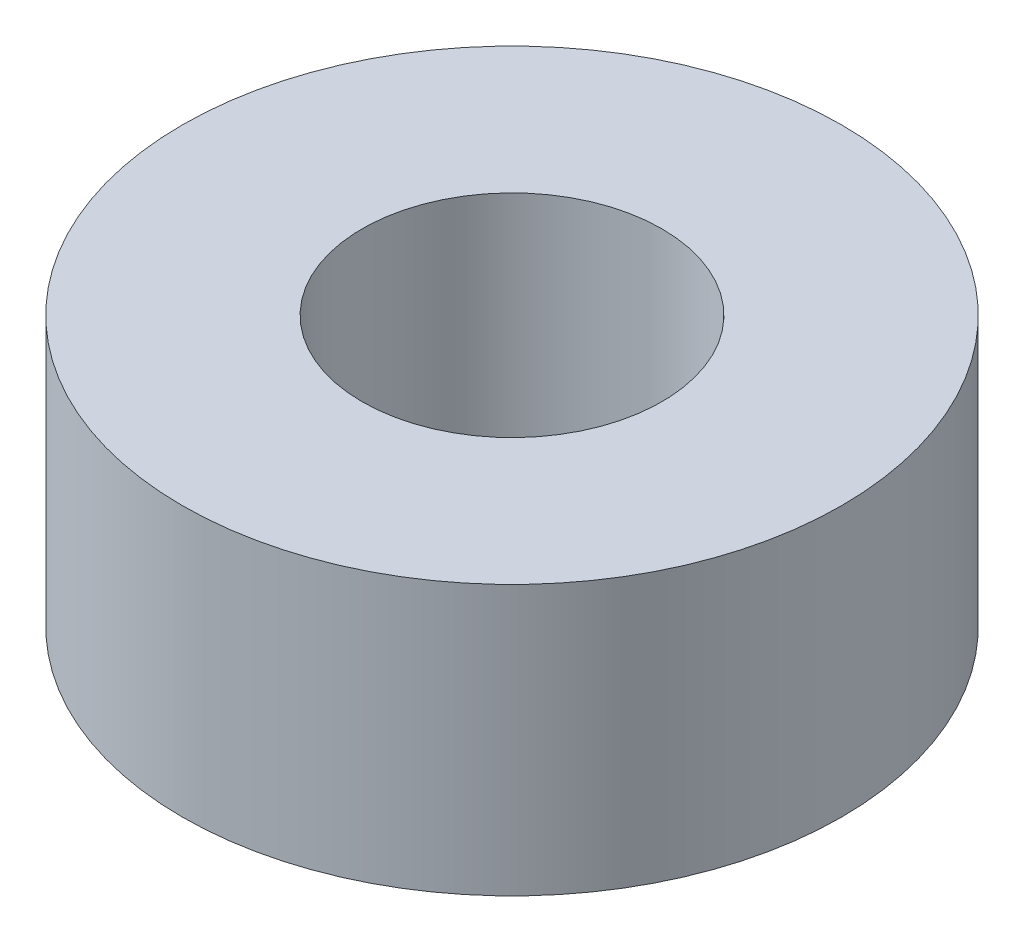
ISO-10303-21;
HEADER;
FILE_DESCRIPTION(('STEP AP214'),'2;1');
FILE_NAME('part.step','',(''),(''),'','','');
FILE_SCHEMA(('AUTOMOTIVE_DESIGN { 1 0 10303 214 1 1 1 1 }'));
ENDSEC;
DATA;
#1=APPLICATION_CONTEXT('core data for automotive mechanical design processes');
#2=APPLICATION_PROTOCOL_DEFINITION('international standard','automotive_design',2000,#1);
#3=PRODUCT_CONTEXT('',#1,'mechanical');
#4=PRODUCT('Part','Part','',(#3));
#5=PRODUCT_RELATED_PRODUCT_CATEGORY('part','',(#4));
#6=PRODUCT_DEFINITION_FORMATION('','',#4);
#7=PRODUCT_DEFINITION_CONTEXT('part definition',#1,'design');
#8=PRODUCT_DEFINITION('design','',#6,#7);
#9=PRODUCT_DEFINITION_SHAPE('','',#8);
#10=(LENGTH_UNIT() NAMED_UNIT(*) SI_UNIT(.MILLI.,.METRE.));
#11=(NAMED_UNIT(*) PLANE_ANGLE_UNIT() SI_UNIT($,.RADIAN.));
#12=(NAMED_UNIT(*) SI_UNIT($,.STERADIAN.) SOLID_ANGLE_UNIT());
#13=UNCERTAINTY_MEASURE_WITH_UNIT(LENGTH_MEASURE(1.E-05),#10,'distance_accuracy_value','');
#14=(GEOMETRIC_REPRESENTATION_CONTEXT(3) GLOBAL_UNCERTAINTY_ASSIGNED_CONTEXT((#13)) GLOBAL_UNIT_ASSIGNED_CONTEXT((#10,
#11,#12)) REPRESENTATION_CONTEXT('',''));
#15=CARTESIAN_POINT('',(0.,0.,0.));
#16=DIRECTION('',(0.,0.,1.));
#17=DIRECTION('',(1.,0.,0.));
#18=AXIS2_PLACEMENT_3D('',#15,#16,#17);
#19=CARTESIAN_POINT('',(0.,24.5,18.));
#20=DIRECTION('',(0.,1.,0.));
#21=DIRECTION('',(0.,0.,1.));
#22=AXIS2_PLACEMENT_3D('',#19,#20,#21);
#23=CYLINDRICAL_SURFACE('',#22,5.);
#24=CARTESIAN_POINT('',(0.,20.,18.));
#25=DIRECTION('',(0.,1.,0.));
#26=DIRECTION('',(0.,0.,1.));
#27=AXIS2_PLACEMENT_3D('',#24,#25,#26);
#28=CIRCLE('',#27,5.);
#29=CARTESIAN_POINT('',(0.,20.,23.));
#30=VERTEX_POINT('',#29);
#31=EDGE_CURVE('E33',#30,#30,#28,.T.);
#32=ORIENTED_EDGE('',*,*,#31,.F.);
#33=EDGE_LOOP('',(#32));
#34=FACE_BOUND('',#33,.T.);
#35=CARTESIAN_POINT('',(0.,29.,18.));
#36=DIRECTION('',(0.,1.,0.));
#37=DIRECTION('',(0.,0.,1.));
#38=AXIS2_PLACEMENT_3D('',#35,#36,#37);
#39=CIRCLE('',#38,5.);
#40=CARTESIAN_POINT('',(0.,29.,23.));
#41=VERTEX_POINT('',#40);
#42=EDGE_CURVE('E21',#41,#41,#39,.F.);
#43=ORIENTED_EDGE('',*,*,#42,.F.);
#44=EDGE_LOOP('',(#43));
#45=FACE_BOUND('',#44,.T.);
#46=ADVANCED_FACE('F17',(#34,#45),#23,.F.);
#47=CARTESIAN_POINT('',(0.,29.,18.));
#48=DIRECTION('',(0.,1.,0.));
#49=DIRECTION('',(0.,0.,1.));
#50=AXIS2_PLACEMENT_3D('',#47,#48,#49);
#51=PLANE('',#50);
#52=CARTESIAN_POINT('',(0.,29.,18.));
#53=DIRECTION('',(0.,1.,0.));
#54=DIRECTION('',(0.,0.,1.));
#55=AXIS2_PLACEMENT_3D('',#52,#53,#54);
#56=CIRCLE('',#55,10.9999);
#57=CARTESIAN_POINT('',(0.,29.,28.9999));
#58=VERTEX_POINT('',#57);
#59=EDGE_CURVE('E26',#58,#58,#56,.F.);
#60=ORIENTED_EDGE('',*,*,#59,.F.);
#61=EDGE_LOOP('',(#60));
#62=FACE_BOUND('',#61,.T.);
#63=ORIENTED_EDGE('',*,*,#42,.T.);
#64=EDGE_LOOP('',(#63));
#65=FACE_BOUND('',#64,.T.);
#66=ADVANCED_FACE('F44',(#62,#65),#51,.T.);
#67=CARTESIAN_POINT('',(0.,20.,18.));
#68=DIRECTION('',(0.,-1.,0.));
#69=DIRECTION('',(0.,0.,-1.));
#70=AXIS2_PLACEMENT_3D('',#67,#68,#69);
#71=PLANE('',#70);
#72=CARTESIAN_POINT('',(0.,20.,18.));
#73=DIRECTION('',(0.,1.,0.));
#74=DIRECTION('',(0.,0.,1.));
#75=AXIS2_PLACEMENT_3D('',#72,#73,#74);
#76=CIRCLE('',#75,10.9999);
#77=CARTESIAN_POINT('',(0.,20.,28.9999));
#78=VERTEX_POINT('',#77);
#79=EDGE_CURVE('E11',#78,#78,#76,.T.);
#80=ORIENTED_EDGE('',*,*,#79,.F.);
#81=EDGE_LOOP('',(#80));
#82=FACE_BOUND('',#81,.T.);
#83=ORIENTED_EDGE('',*,*,#31,.T.);
#84=EDGE_LOOP('',(#83));
#85=FACE_BOUND('',#84,.T.);
#86=ADVANCED_FACE('F52',(#82,#85),#71,.T.);
#87=CARTESIAN_POINT('',(0.,24.5,18.));
#88=DIRECTION('',(0.,1.,0.));
#89=DIRECTION('',(0.,0.,1.));
#90=AXIS2_PLACEMENT_3D('',#87,#88,#89);
#91=CYLINDRICAL_SURFACE('',#90,10.9999);
#92=ORIENTED_EDGE('',*,*,#59,.T.);
#93=EDGE_LOOP('',(#92));
#94=FACE_BOUND('',#93,.T.);
#95=ORIENTED_EDGE('',*,*,#79,.T.);
#96=EDGE_LOOP('',(#95));
#97=FACE_BOUND('',#96,.T.);
#98=ADVANCED_FACE('F54',(#94,#97),#91,.T.);
#99=CLOSED_SHELL('',(#46,#66,#86,#98));
#100=MANIFOLD_SOLID_BREP('B1',#99);
#101=ADVANCED_BREP_SHAPE_REPRESENTATION('',(#18,#100),#14);
#102=SHAPE_DEFINITION_REPRESENTATION(#9,#101);
ENDSEC;
END-ISO-10303-21;
